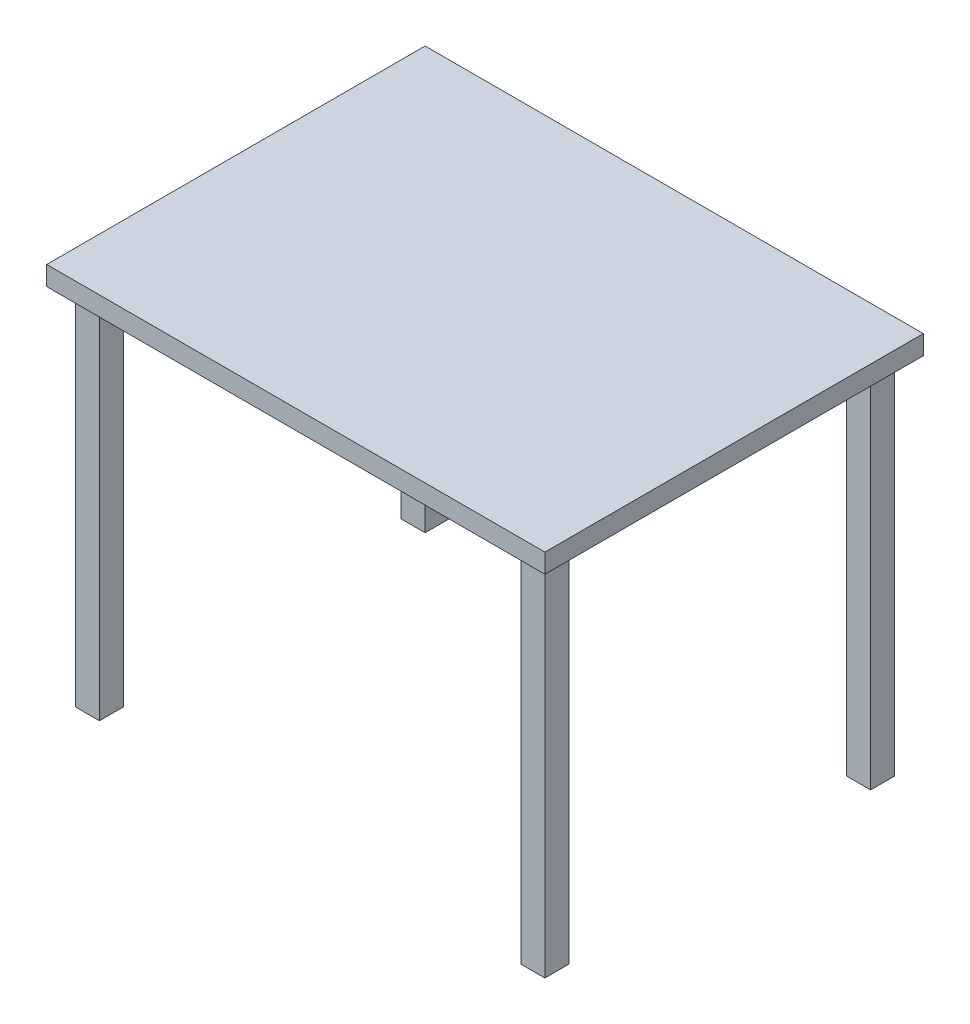
ISO-10303-21;
HEADER;
FILE_DESCRIPTION(('STEP AP214'),'2;1');
FILE_NAME('part.step','',(''),(''),'','','');
FILE_SCHEMA(('AUTOMOTIVE_DESIGN { 1 0 10303 214 1 1 1 1 }'));
ENDSEC;
DATA;
#1=APPLICATION_CONTEXT('core data for automotive mechanical design processes');
#2=APPLICATION_PROTOCOL_DEFINITION('international standard','automotive_design',2000,#1);
#3=PRODUCT_CONTEXT('',#1,'mechanical');
#4=PRODUCT('Part','Part','',(#3));
#5=PRODUCT_RELATED_PRODUCT_CATEGORY('part','',(#4));
#6=PRODUCT_DEFINITION_FORMATION('','',#4);
#7=PRODUCT_DEFINITION_CONTEXT('part definition',#1,'design');
#8=PRODUCT_DEFINITION('design','',#6,#7);
#9=PRODUCT_DEFINITION_SHAPE('','',#8);
#10=(LENGTH_UNIT() NAMED_UNIT(*) SI_UNIT(.MILLI.,.METRE.));
#11=(NAMED_UNIT(*) PLANE_ANGLE_UNIT() SI_UNIT($,.RADIAN.));
#12=(NAMED_UNIT(*) SI_UNIT($,.STERADIAN.) SOLID_ANGLE_UNIT());
#13=UNCERTAINTY_MEASURE_WITH_UNIT(LENGTH_MEASURE(1.E-05),#10,'distance_accuracy_value','');
#14=(GEOMETRIC_REPRESENTATION_CONTEXT(3) GLOBAL_UNCERTAINTY_ASSIGNED_CONTEXT((#13)) GLOBAL_UNIT_ASSIGNED_CONTEXT((#10,
#11,#12)) REPRESENTATION_CONTEXT('',''));
#15=CARTESIAN_POINT('',(0.,0.,0.));
#16=DIRECTION('',(0.,0.,1.));
#17=DIRECTION('',(1.,0.,0.));
#18=AXIS2_PLACEMENT_3D('',#15,#16,#17);
#19=CARTESIAN_POINT('',(0.,-20.,0.));
#20=DIRECTION('',(0.,-1.,0.));
#21=DIRECTION('',(0.,0.,-1.));
#22=AXIS2_PLACEMENT_3D('',#19,#20,#21);
#23=PLANE('',#22);
#24=DIRECTION('',(0.,0.,-1.));
#25=VECTOR('',#24,1.);
#26=CARTESIAN_POINT('',(520.,-20.,395.));
#27=LINE('',#26,#25);
#28=CARTESIAN_POINT('',(520.,-20.,395.));
#29=VERTEX_POINT('',#28);
#30=CARTESIAN_POINT('',(520.,-20.,-395.));
#31=VERTEX_POINT('',#30);
#32=EDGE_CURVE('E332',#29,#31,#27,.T.);
#33=ORIENTED_EDGE('',*,*,#32,.F.);
#34=DIRECTION('',(1.,0.,0.));
#35=VECTOR('',#34,1.);
#36=CARTESIAN_POINT('',(-520.,-20.,395.));
#37=LINE('',#36,#35);
#38=CARTESIAN_POINT('',(-520.,-20.,395.));
#39=VERTEX_POINT('',#38);
#40=EDGE_CURVE('E338',#39,#29,#37,.T.);
#41=ORIENTED_EDGE('',*,*,#40,.F.);
#42=DIRECTION('',(0.,0.,1.));
#43=VECTOR('',#42,1.);
#44=CARTESIAN_POINT('',(-520.,-20.,395.));
#45=LINE('',#44,#43);
#46=CARTESIAN_POINT('',(-520.,-20.,-395.));
#47=VERTEX_POINT('',#46);
#48=EDGE_CURVE('E354',#47,#39,#45,.T.);
#49=ORIENTED_EDGE('',*,*,#48,.F.);
#50=DIRECTION('',(-1.,0.,0.));
#51=VECTOR('',#50,1.);
#52=CARTESIAN_POINT('',(-520.,-20.,-395.));
#53=LINE('',#52,#51);
#54=EDGE_CURVE('E351',#31,#47,#53,.T.);
#55=ORIENTED_EDGE('',*,*,#54,.F.);
#56=EDGE_LOOP('',(#33,#41,#49,#55));
#57=FACE_BOUND('',#56,.T.);
#58=DIRECTION('',(1.,0.,0.));
#59=VECTOR('',#58,1.);
#60=CARTESIAN_POINT('',(-490.,-20.,315.));
#61=LINE('',#60,#59);
#62=CARTESIAN_POINT('',(-490.,-20.,315.));
#63=VERTEX_POINT('',#62);
#64=CARTESIAN_POINT('',(-440.,-20.,315.));
#65=VERTEX_POINT('',#64);
#66=EDGE_CURVE('E310',#63,#65,#61,.T.);
#67=ORIENTED_EDGE('',*,*,#66,.F.);
#68=DIRECTION('',(0.,0.,-1.));
#69=VECTOR('',#68,1.);
#70=CARTESIAN_POINT('',(-490.,-20.,365.));
#71=LINE('',#70,#69);
#72=CARTESIAN_POINT('',(-490.,-20.,365.));
#73=VERTEX_POINT('',#72);
#74=EDGE_CURVE('E291',#73,#63,#71,.T.);
#75=ORIENTED_EDGE('',*,*,#74,.F.);
#76=DIRECTION('',(-1.,0.,0.));
#77=VECTOR('',#76,1.);
#78=CARTESIAN_POINT('',(-490.,-20.,365.));
#79=LINE('',#78,#77);
#80=CARTESIAN_POINT('',(-440.,-20.,365.));
#81=VERTEX_POINT('',#80);
#82=EDGE_CURVE('E297',#81,#73,#79,.T.);
#83=ORIENTED_EDGE('',*,*,#82,.F.);
#84=DIRECTION('',(0.,0.,1.));
#85=VECTOR('',#84,1.);
#86=CARTESIAN_POINT('',(-440.,-20.,365.));
#87=LINE('',#86,#85);
#88=EDGE_CURVE('E313',#65,#81,#87,.T.);
#89=ORIENTED_EDGE('',*,*,#88,.F.);
#90=EDGE_LOOP('',(#67,#75,#83,#89));
#91=FACE_BOUND('',#90,.T.);
#92=DIRECTION('',(1.,0.,0.));
#93=VECTOR('',#92,1.);
#94=CARTESIAN_POINT('',(-490.,-20.,-365.));
#95=LINE('',#94,#93);
#96=CARTESIAN_POINT('',(-490.,-20.,-365.));
#97=VERTEX_POINT('',#96);
#98=CARTESIAN_POINT('',(-440.,-20.,-365.));
#99=VERTEX_POINT('',#98);
#100=EDGE_CURVE('E269',#97,#99,#95,.T.);
#101=ORIENTED_EDGE('',*,*,#100,.F.);
#102=DIRECTION('',(0.,0.,-1.));
#103=VECTOR('',#102,1.);
#104=CARTESIAN_POINT('',(-490.,-20.,-365.));
#105=LINE('',#104,#103);
#106=CARTESIAN_POINT('',(-490.,-20.,-315.));
#107=VERTEX_POINT('',#106);
#108=EDGE_CURVE('E250',#107,#97,#105,.T.);
#109=ORIENTED_EDGE('',*,*,#108,.F.);
#110=DIRECTION('',(-1.,0.,0.));
#111=VECTOR('',#110,1.);
#112=CARTESIAN_POINT('',(-490.,-20.,-315.));
#113=LINE('',#112,#111);
#114=CARTESIAN_POINT('',(-440.,-20.,-315.));
#115=VERTEX_POINT('',#114);
#116=EDGE_CURVE('E256',#115,#107,#113,.T.);
#117=ORIENTED_EDGE('',*,*,#116,.F.);
#118=DIRECTION('',(0.,0.,1.));
#119=VECTOR('',#118,1.);
#120=CARTESIAN_POINT('',(-440.,-20.,-365.));
#121=LINE('',#120,#119);
#122=EDGE_CURVE('E272',#99,#115,#121,.T.);
#123=ORIENTED_EDGE('',*,*,#122,.F.);
#124=EDGE_LOOP('',(#101,#109,#117,#123));
#125=FACE_BOUND('',#124,.T.);
#126=DIRECTION('',(0.,0.,1.));
#127=VECTOR('',#126,1.);
#128=CARTESIAN_POINT('',(490.,-20.,-365.));
#129=LINE('',#128,#127);
#130=CARTESIAN_POINT('',(490.,-20.,-365.));
#131=VERTEX_POINT('',#130);
#132=CARTESIAN_POINT('',(490.,-20.,-315.));
#133=VERTEX_POINT('',#132);
#134=EDGE_CURVE('E211',#131,#133,#129,.T.);
#135=ORIENTED_EDGE('',*,*,#134,.F.);
#136=DIRECTION('',(1.,0.,0.));
#137=VECTOR('',#136,1.);
#138=CARTESIAN_POINT('',(490.,-20.,-365.));
#139=LINE('',#138,#137);
#140=CARTESIAN_POINT('',(440.,-20.,-365.));
#141=VERTEX_POINT('',#140);
#142=EDGE_CURVE('E206',#141,#131,#139,.T.);
#143=ORIENTED_EDGE('',*,*,#142,.F.);
#144=DIRECTION('',(0.,0.,-1.));
#145=VECTOR('',#144,1.);
#146=CARTESIAN_POINT('',(440.,-20.,-365.));
#147=LINE('',#146,#145);
#148=CARTESIAN_POINT('',(440.,-20.,-315.));
#149=VERTEX_POINT('',#148);
#150=EDGE_CURVE('E221',#149,#141,#147,.T.);
#151=ORIENTED_EDGE('',*,*,#150,.F.);
#152=DIRECTION('',(-1.,0.,0.));
#153=VECTOR('',#152,1.);
#154=CARTESIAN_POINT('',(490.,-20.,-315.));
#155=LINE('',#154,#153);
#156=EDGE_CURVE('E233',#133,#149,#155,.T.);
#157=ORIENTED_EDGE('',*,*,#156,.F.);
#158=EDGE_LOOP('',(#135,#143,#151,#157));
#159=FACE_BOUND('',#158,.T.);
#160=DIRECTION('',(-1.,0.,0.));
#161=VECTOR('',#160,1.);
#162=CARTESIAN_POINT('',(490.,-20.,365.));
#163=LINE('',#162,#161);
#164=CARTESIAN_POINT('',(490.,-20.,365.));
#165=VERTEX_POINT('',#164);
#166=CARTESIAN_POINT('',(440.,-20.,365.));
#167=VERTEX_POINT('',#166);
#168=EDGE_CURVE('E635',#165,#167,#163,.T.);
#169=ORIENTED_EDGE('',*,*,#168,.F.);
#170=DIRECTION('',(0.,0.,1.));
#171=VECTOR('',#170,1.);
#172=CARTESIAN_POINT('',(490.,-20.,365.));
#173=LINE('',#172,#171);
#174=CARTESIAN_POINT('',(490.,-20.,315.));
#175=VERTEX_POINT('',#174);
#176=EDGE_CURVE('E203',#175,#165,#173,.T.);
#177=ORIENTED_EDGE('',*,*,#176,.F.);
#178=DIRECTION('',(1.,0.,0.));
#179=VECTOR('',#178,1.);
#180=CARTESIAN_POINT('',(490.,-20.,315.));
#181=LINE('',#180,#179);
#182=CARTESIAN_POINT('',(440.,-20.,315.));
#183=VERTEX_POINT('',#182);
#184=EDGE_CURVE('E199',#183,#175,#181,.T.);
#185=ORIENTED_EDGE('',*,*,#184,.F.);
#186=DIRECTION('',(0.,0.,-1.));
#187=VECTOR('',#186,1.);
#188=CARTESIAN_POINT('',(440.,-20.,365.));
#189=LINE('',#188,#187);
#190=EDGE_CURVE('E631',#167,#183,#189,.T.);
#191=ORIENTED_EDGE('',*,*,#190,.F.);
#192=EDGE_LOOP('',(#169,#177,#185,#191));
#193=FACE_BOUND('',#192,.T.);
#194=ADVANCED_FACE('F39',(#57,#91,#125,#159,#193),#23,.T.);
#195=CARTESIAN_POINT('',(520.,20.,395.));
#196=DIRECTION('',(-1.,0.,0.));
#197=DIRECTION('',(0.,0.,1.));
#198=AXIS2_PLACEMENT_3D('',#195,#196,#197);
#199=PLANE('',#198);
#200=ORIENTED_EDGE('',*,*,#32,.T.);
#201=DIRECTION('',(0.,-1.,0.));
#202=VECTOR('',#201,1.);
#203=CARTESIAN_POINT('',(520.,20.,-395.));
#204=LINE('',#203,#202);
#205=CARTESIAN_POINT('',(520.,20.,-395.));
#206=VERTEX_POINT('',#205);
#207=EDGE_CURVE('E11',#206,#31,#204,.T.);
#208=ORIENTED_EDGE('',*,*,#207,.F.);
#209=DIRECTION('',(0.,0.,-1.));
#210=VECTOR('',#209,1.);
#211=CARTESIAN_POINT('',(520.,20.,395.));
#212=LINE('',#211,#210);
#213=CARTESIAN_POINT('',(520.,20.,395.));
#214=VERTEX_POINT('',#213);
#215=EDGE_CURVE('E333',#214,#206,#212,.T.);
#216=ORIENTED_EDGE('',*,*,#215,.F.);
#217=DIRECTION('',(0.,-1.,0.));
#218=VECTOR('',#217,1.);
#219=CARTESIAN_POINT('',(520.,20.,395.));
#220=LINE('',#219,#218);
#221=EDGE_CURVE('E347',#214,#29,#220,.T.);
#222=ORIENTED_EDGE('',*,*,#221,.T.);
#223=EDGE_LOOP('',(#200,#208,#216,#222));
#224=FACE_BOUND('',#223,.T.);
#225=ADVANCED_FACE('F41',(#224),#199,.F.);
#226=CARTESIAN_POINT('',(-520.,20.,-395.));
#227=DIRECTION('',(0.,0.,1.));
#228=DIRECTION('',(1.,0.,0.));
#229=AXIS2_PLACEMENT_3D('',#226,#227,#228);
#230=PLANE('',#229);
#231=ORIENTED_EDGE('',*,*,#54,.T.);
#232=DIRECTION('',(0.,-1.,0.));
#233=VECTOR('',#232,1.);
#234=CARTESIAN_POINT('',(-520.,20.,-395.));
#235=LINE('',#234,#233);
#236=CARTESIAN_POINT('',(-520.,20.,-395.));
#237=VERTEX_POINT('',#236);
#238=EDGE_CURVE('E48',#237,#47,#235,.T.);
#239=ORIENTED_EDGE('',*,*,#238,.F.);
#240=DIRECTION('',(-1.,0.,0.));
#241=VECTOR('',#240,1.);
#242=CARTESIAN_POINT('',(-520.,20.,-395.));
#243=LINE('',#242,#241);
#244=EDGE_CURVE('E337',#206,#237,#243,.T.);
#245=ORIENTED_EDGE('',*,*,#244,.F.);
#246=ORIENTED_EDGE('',*,*,#207,.T.);
#247=EDGE_LOOP('',(#231,#239,#245,#246));
#248=FACE_BOUND('',#247,.T.);
#249=ADVANCED_FACE('F387',(#248),#230,.F.);
#250=CARTESIAN_POINT('',(-520.,20.,395.));
#251=DIRECTION('',(1.,0.,0.));
#252=DIRECTION('',(0.,0.,-1.));
#253=AXIS2_PLACEMENT_3D('',#250,#251,#252);
#254=PLANE('',#253);
#255=ORIENTED_EDGE('',*,*,#48,.T.);
#256=DIRECTION('',(0.,-1.,0.));
#257=VECTOR('',#256,1.);
#258=CARTESIAN_POINT('',(-520.,20.,395.));
#259=LINE('',#258,#257);
#260=CARTESIAN_POINT('',(-520.,20.,395.));
#261=VERTEX_POINT('',#260);
#262=EDGE_CURVE('E362',#261,#39,#259,.T.);
#263=ORIENTED_EDGE('',*,*,#262,.F.);
#264=DIRECTION('',(0.,0.,1.));
#265=VECTOR('',#264,1.);
#266=CARTESIAN_POINT('',(-520.,20.,395.));
#267=LINE('',#266,#265);
#268=EDGE_CURVE('E341',#237,#261,#267,.T.);
#269=ORIENTED_EDGE('',*,*,#268,.F.);
#270=ORIENTED_EDGE('',*,*,#238,.T.);
#271=EDGE_LOOP('',(#255,#263,#269,#270));
#272=FACE_BOUND('',#271,.T.);
#273=ADVANCED_FACE('F371',(#272),#254,.F.);
#274=CARTESIAN_POINT('',(-520.,20.,395.));
#275=DIRECTION('',(0.,0.,-1.));
#276=DIRECTION('',(-1.,0.,0.));
#277=AXIS2_PLACEMENT_3D('',#274,#275,#276);
#278=PLANE('',#277);
#279=ORIENTED_EDGE('',*,*,#40,.T.);
#280=ORIENTED_EDGE('',*,*,#221,.F.);
#281=DIRECTION('',(1.,0.,0.));
#282=VECTOR('',#281,1.);
#283=CARTESIAN_POINT('',(-520.,20.,395.));
#284=LINE('',#283,#282);
#285=EDGE_CURVE('E344',#261,#214,#284,.T.);
#286=ORIENTED_EDGE('',*,*,#285,.F.);
#287=ORIENTED_EDGE('',*,*,#262,.T.);
#288=EDGE_LOOP('',(#279,#280,#286,#287));
#289=FACE_BOUND('',#288,.T.);
#290=ADVANCED_FACE('F380',(#289),#278,.F.);
#291=CARTESIAN_POINT('',(0.,20.,0.));
#292=DIRECTION('',(0.,-1.,0.));
#293=DIRECTION('',(0.,0.,-1.));
#294=AXIS2_PLACEMENT_3D('',#291,#292,#293);
#295=PLANE('',#294);
#296=ORIENTED_EDGE('',*,*,#215,.T.);
#297=ORIENTED_EDGE('',*,*,#244,.T.);
#298=ORIENTED_EDGE('',*,*,#268,.T.);
#299=ORIENTED_EDGE('',*,*,#285,.T.);
#300=EDGE_LOOP('',(#296,#297,#298,#299));
#301=FACE_BOUND('',#300,.T.);
#302=ADVANCED_FACE('F386',(#301),#295,.F.);
#303=CARTESIAN_POINT('',(-490.,-780.,365.));
#304=DIRECTION('',(1.,0.,0.));
#305=DIRECTION('',(0.,0.,-1.));
#306=AXIS2_PLACEMENT_3D('',#303,#304,#305);
#307=PLANE('',#306);
#308=ORIENTED_EDGE('',*,*,#74,.T.);
#309=DIRECTION('',(0.,1.,0.));
#310=VECTOR('',#309,1.);
#311=CARTESIAN_POINT('',(-490.,-780.,315.));
#312=LINE('',#311,#310);
#313=CARTESIAN_POINT('',(-490.,-780.,315.));
#314=VERTEX_POINT('',#313);
#315=EDGE_CURVE('E329',#314,#63,#312,.T.);
#316=ORIENTED_EDGE('',*,*,#315,.F.);
#317=DIRECTION('',(0.,0.,-1.));
#318=VECTOR('',#317,1.);
#319=CARTESIAN_POINT('',(-490.,-780.,365.));
#320=LINE('',#319,#318);
#321=CARTESIAN_POINT('',(-490.,-780.,365.));
#322=VERTEX_POINT('',#321);
#323=EDGE_CURVE('E292',#322,#314,#320,.T.);
#324=ORIENTED_EDGE('',*,*,#323,.F.);
#325=DIRECTION('',(0.,1.,0.));
#326=VECTOR('',#325,1.);
#327=CARTESIAN_POINT('',(-490.,-780.,365.));
#328=LINE('',#327,#326);
#329=EDGE_CURVE('E306',#322,#73,#328,.T.);
#330=ORIENTED_EDGE('',*,*,#329,.T.);
#331=EDGE_LOOP('',(#308,#316,#324,#330));
#332=FACE_BOUND('',#331,.T.);
#333=ADVANCED_FACE('F405',(#332),#307,.F.);
#334=CARTESIAN_POINT('',(-490.,-780.,315.));
#335=DIRECTION('',(0.,0.,1.));
#336=DIRECTION('',(1.,0.,0.));
#337=AXIS2_PLACEMENT_3D('',#334,#335,#336);
#338=PLANE('',#337);
#339=ORIENTED_EDGE('',*,*,#66,.T.);
#340=DIRECTION('',(0.,1.,0.));
#341=VECTOR('',#340,1.);
#342=CARTESIAN_POINT('',(-440.,-780.,315.));
#343=LINE('',#342,#341);
#344=CARTESIAN_POINT('',(-440.,-780.,315.));
#345=VERTEX_POINT('',#344);
#346=EDGE_CURVE('E325',#345,#65,#343,.T.);
#347=ORIENTED_EDGE('',*,*,#346,.F.);
#348=DIRECTION('',(1.,0.,0.));
#349=VECTOR('',#348,1.);
#350=CARTESIAN_POINT('',(-490.,-780.,315.));
#351=LINE('',#350,#349);
#352=EDGE_CURVE('E296',#314,#345,#351,.T.);
#353=ORIENTED_EDGE('',*,*,#352,.F.);
#354=ORIENTED_EDGE('',*,*,#315,.T.);
#355=EDGE_LOOP('',(#339,#347,#353,#354));
#356=FACE_BOUND('',#355,.T.);
#357=ADVANCED_FACE('F409',(#356),#338,.F.);
#358=CARTESIAN_POINT('',(-440.,-780.,365.));
#359=DIRECTION('',(-1.,0.,0.));
#360=DIRECTION('',(0.,0.,1.));
#361=AXIS2_PLACEMENT_3D('',#358,#359,#360);
#362=PLANE('',#361);
#363=ORIENTED_EDGE('',*,*,#88,.T.);
#364=DIRECTION('',(0.,1.,0.));
#365=VECTOR('',#364,1.);
#366=CARTESIAN_POINT('',(-440.,-780.,365.));
#367=LINE('',#366,#365);
#368=CARTESIAN_POINT('',(-440.,-780.,365.));
#369=VERTEX_POINT('',#368);
#370=EDGE_CURVE('E322',#369,#81,#367,.T.);
#371=ORIENTED_EDGE('',*,*,#370,.F.);
#372=DIRECTION('',(0.,0.,1.));
#373=VECTOR('',#372,1.);
#374=CARTESIAN_POINT('',(-440.,-780.,365.));
#375=LINE('',#374,#373);
#376=EDGE_CURVE('E300',#345,#369,#375,.T.);
#377=ORIENTED_EDGE('',*,*,#376,.F.);
#378=ORIENTED_EDGE('',*,*,#346,.T.);
#379=EDGE_LOOP('',(#363,#371,#377,#378));
#380=FACE_BOUND('',#379,.T.);
#381=ADVANCED_FACE('F414',(#380),#362,.F.);
#382=CARTESIAN_POINT('',(-490.,-780.,365.));
#383=DIRECTION('',(0.,0.,-1.));
#384=DIRECTION('',(-1.,0.,0.));
#385=AXIS2_PLACEMENT_3D('',#382,#383,#384);
#386=PLANE('',#385);
#387=ORIENTED_EDGE('',*,*,#82,.T.);
#388=ORIENTED_EDGE('',*,*,#329,.F.);
#389=DIRECTION('',(-1.,0.,0.));
#390=VECTOR('',#389,1.);
#391=CARTESIAN_POINT('',(-490.,-780.,365.));
#392=LINE('',#391,#390);
#393=EDGE_CURVE('E303',#369,#322,#392,.T.);
#394=ORIENTED_EDGE('',*,*,#393,.F.);
#395=ORIENTED_EDGE('',*,*,#370,.T.);
#396=EDGE_LOOP('',(#387,#388,#394,#395));
#397=FACE_BOUND('',#396,.T.);
#398=ADVANCED_FACE('F420',(#397),#386,.F.);
#399=CARTESIAN_POINT('',(0.,-780.,0.));
#400=DIRECTION('',(0.,-1.,0.));
#401=DIRECTION('',(0.,0.,-1.));
#402=AXIS2_PLACEMENT_3D('',#399,#400,#401);
#403=PLANE('',#402);
#404=ORIENTED_EDGE('',*,*,#323,.T.);
#405=ORIENTED_EDGE('',*,*,#352,.T.);
#406=ORIENTED_EDGE('',*,*,#376,.T.);
#407=ORIENTED_EDGE('',*,*,#393,.T.);
#408=EDGE_LOOP('',(#404,#405,#406,#407));
#409=FACE_BOUND('',#408,.T.);
#410=ADVANCED_FACE('F424',(#409),#403,.T.);
#411=CARTESIAN_POINT('',(-490.,-780.,-365.));
#412=DIRECTION('',(1.,0.,0.));
#413=DIRECTION('',(0.,0.,-1.));
#414=AXIS2_PLACEMENT_3D('',#411,#412,#413);
#415=PLANE('',#414);
#416=ORIENTED_EDGE('',*,*,#108,.T.);
#417=DIRECTION('',(0.,1.,0.));
#418=VECTOR('',#417,1.);
#419=CARTESIAN_POINT('',(-490.,-780.,-365.));
#420=LINE('',#419,#418);
#421=CARTESIAN_POINT('',(-490.,-780.,-365.));
#422=VERTEX_POINT('',#421);
#423=EDGE_CURVE('E288',#422,#97,#420,.T.);
#424=ORIENTED_EDGE('',*,*,#423,.F.);
#425=DIRECTION('',(0.,0.,-1.));
#426=VECTOR('',#425,1.);
#427=CARTESIAN_POINT('',(-490.,-780.,-365.));
#428=LINE('',#427,#426);
#429=CARTESIAN_POINT('',(-490.,-780.,-315.));
#430=VERTEX_POINT('',#429);
#431=EDGE_CURVE('E251',#430,#422,#428,.T.);
#432=ORIENTED_EDGE('',*,*,#431,.F.);
#433=DIRECTION('',(0.,1.,0.));
#434=VECTOR('',#433,1.);
#435=CARTESIAN_POINT('',(-490.,-780.,-315.));
#436=LINE('',#435,#434);
#437=EDGE_CURVE('E265',#430,#107,#436,.T.);
#438=ORIENTED_EDGE('',*,*,#437,.T.);
#439=EDGE_LOOP('',(#416,#424,#432,#438));
#440=FACE_BOUND('',#439,.T.);
#441=ADVANCED_FACE('F428',(#440),#415,.F.);
#442=CARTESIAN_POINT('',(-490.,-780.,-365.));
#443=DIRECTION('',(0.,0.,1.));
#444=DIRECTION('',(1.,0.,0.));
#445=AXIS2_PLACEMENT_3D('',#442,#443,#444);
#446=PLANE('',#445);
#447=ORIENTED_EDGE('',*,*,#100,.T.);
#448=DIRECTION('',(0.,1.,0.));
#449=VECTOR('',#448,1.);
#450=CARTESIAN_POINT('',(-440.,-780.,-365.));
#451=LINE('',#450,#449);
#452=CARTESIAN_POINT('',(-440.,-780.,-365.));
#453=VERTEX_POINT('',#452);
#454=EDGE_CURVE('E284',#453,#99,#451,.T.);
#455=ORIENTED_EDGE('',*,*,#454,.F.);
#456=DIRECTION('',(1.,0.,0.));
#457=VECTOR('',#456,1.);
#458=CARTESIAN_POINT('',(-490.,-780.,-365.));
#459=LINE('',#458,#457);
#460=EDGE_CURVE('E255',#422,#453,#459,.T.);
#461=ORIENTED_EDGE('',*,*,#460,.F.);
#462=ORIENTED_EDGE('',*,*,#423,.T.);
#463=EDGE_LOOP('',(#447,#455,#461,#462));
#464=FACE_BOUND('',#463,.T.);
#465=ADVANCED_FACE('F432',(#464),#446,.F.);
#466=CARTESIAN_POINT('',(-440.,-780.,-365.));
#467=DIRECTION('',(-1.,0.,0.));
#468=DIRECTION('',(0.,0.,1.));
#469=AXIS2_PLACEMENT_3D('',#466,#467,#468);
#470=PLANE('',#469);
#471=ORIENTED_EDGE('',*,*,#122,.T.);
#472=DIRECTION('',(0.,1.,0.));
#473=VECTOR('',#472,1.);
#474=CARTESIAN_POINT('',(-440.,-780.,-315.));
#475=LINE('',#474,#473);
#476=CARTESIAN_POINT('',(-440.,-780.,-315.));
#477=VERTEX_POINT('',#476);
#478=EDGE_CURVE('E281',#477,#115,#475,.T.);
#479=ORIENTED_EDGE('',*,*,#478,.F.);
#480=DIRECTION('',(0.,0.,1.));
#481=VECTOR('',#480,1.);
#482=CARTESIAN_POINT('',(-440.,-780.,-365.));
#483=LINE('',#482,#481);
#484=EDGE_CURVE('E259',#453,#477,#483,.T.);
#485=ORIENTED_EDGE('',*,*,#484,.F.);
#486=ORIENTED_EDGE('',*,*,#454,.T.);
#487=EDGE_LOOP('',(#471,#479,#485,#486));
#488=FACE_BOUND('',#487,.T.);
#489=ADVANCED_FACE('F436',(#488),#470,.F.);
#490=CARTESIAN_POINT('',(-490.,-780.,-315.));
#491=DIRECTION('',(0.,0.,-1.));
#492=DIRECTION('',(-1.,0.,0.));
#493=AXIS2_PLACEMENT_3D('',#490,#491,#492);
#494=PLANE('',#493);
#495=ORIENTED_EDGE('',*,*,#116,.T.);
#496=ORIENTED_EDGE('',*,*,#437,.F.);
#497=DIRECTION('',(-1.,0.,0.));
#498=VECTOR('',#497,1.);
#499=CARTESIAN_POINT('',(-490.,-780.,-315.));
#500=LINE('',#499,#498);
#501=EDGE_CURVE('E262',#477,#430,#500,.T.);
#502=ORIENTED_EDGE('',*,*,#501,.F.);
#503=ORIENTED_EDGE('',*,*,#478,.T.);
#504=EDGE_LOOP('',(#495,#496,#502,#503));
#505=FACE_BOUND('',#504,.T.);
#506=ADVANCED_FACE('F440',(#505),#494,.F.);
#507=CARTESIAN_POINT('',(0.,-780.,0.));
#508=DIRECTION('',(0.,1.,0.));
#509=DIRECTION('',(0.,0.,1.));
#510=AXIS2_PLACEMENT_3D('',#507,#508,#509);
#511=PLANE('',#510);
#512=ORIENTED_EDGE('',*,*,#431,.T.);
#513=ORIENTED_EDGE('',*,*,#460,.T.);
#514=ORIENTED_EDGE('',*,*,#484,.T.);
#515=ORIENTED_EDGE('',*,*,#501,.T.);
#516=EDGE_LOOP('',(#512,#513,#514,#515));
#517=FACE_BOUND('',#516,.T.);
#518=ADVANCED_FACE('F444',(#517),#511,.F.);
#519=CARTESIAN_POINT('',(490.,-780.,-365.));
#520=DIRECTION('',(0.,0.,1.));
#521=DIRECTION('',(1.,0.,0.));
#522=AXIS2_PLACEMENT_3D('',#519,#520,#521);
#523=PLANE('',#522);
#524=ORIENTED_EDGE('',*,*,#142,.T.);
#525=DIRECTION('',(0.,1.,0.));
#526=VECTOR('',#525,1.);
#527=CARTESIAN_POINT('',(490.,-780.,-365.));
#528=LINE('',#527,#526);
#529=CARTESIAN_POINT('',(490.,-780.,-365.));
#530=VERTEX_POINT('',#529);
#531=EDGE_CURVE('E247',#530,#131,#528,.T.);
#532=ORIENTED_EDGE('',*,*,#531,.F.);
#533=DIRECTION('',(1.,0.,0.));
#534=VECTOR('',#533,1.);
#535=CARTESIAN_POINT('',(490.,-780.,-365.));
#536=LINE('',#535,#534);
#537=CARTESIAN_POINT('',(440.,-780.,-365.));
#538=VERTEX_POINT('',#537);
#539=EDGE_CURVE('E216',#538,#530,#536,.T.);
#540=ORIENTED_EDGE('',*,*,#539,.F.);
#541=DIRECTION('',(0.,1.,0.));
#542=VECTOR('',#541,1.);
#543=CARTESIAN_POINT('',(440.,-780.,-365.));
#544=LINE('',#543,#542);
#545=EDGE_CURVE('E229',#538,#141,#544,.T.);
#546=ORIENTED_EDGE('',*,*,#545,.T.);
#547=EDGE_LOOP('',(#524,#532,#540,#546));
#548=FACE_BOUND('',#547,.T.);
#549=ADVANCED_FACE('F448',(#548),#523,.F.);
#550=CARTESIAN_POINT('',(490.,-780.,-365.));
#551=DIRECTION('',(-1.,0.,0.));
#552=DIRECTION('',(0.,0.,1.));
#553=AXIS2_PLACEMENT_3D('',#550,#551,#552);
#554=PLANE('',#553);
#555=ORIENTED_EDGE('',*,*,#134,.T.);
#556=DIRECTION('',(0.,1.,0.));
#557=VECTOR('',#556,1.);
#558=CARTESIAN_POINT('',(490.,-780.,-315.));
#559=LINE('',#558,#557);
#560=CARTESIAN_POINT('',(490.,-780.,-315.));
#561=VERTEX_POINT('',#560);
#562=EDGE_CURVE('E243',#561,#133,#559,.T.);
#563=ORIENTED_EDGE('',*,*,#562,.F.);
#564=DIRECTION('',(0.,0.,1.));
#565=VECTOR('',#564,1.);
#566=CARTESIAN_POINT('',(490.,-780.,-365.));
#567=LINE('',#566,#565);
#568=EDGE_CURVE('E220',#530,#561,#567,.T.);
#569=ORIENTED_EDGE('',*,*,#568,.F.);
#570=ORIENTED_EDGE('',*,*,#531,.T.);
#571=EDGE_LOOP('',(#555,#563,#569,#570));
#572=FACE_BOUND('',#571,.T.);
#573=ADVANCED_FACE('F452',(#572),#554,.F.);
#574=CARTESIAN_POINT('',(490.,-780.,-315.));
#575=DIRECTION('',(0.,0.,-1.));
#576=DIRECTION('',(-1.,0.,0.));
#577=AXIS2_PLACEMENT_3D('',#574,#575,#576);
#578=PLANE('',#577);
#579=ORIENTED_EDGE('',*,*,#156,.T.);
#580=DIRECTION('',(0.,1.,0.));
#581=VECTOR('',#580,1.);
#582=CARTESIAN_POINT('',(440.,-780.,-315.));
#583=LINE('',#582,#581);
#584=CARTESIAN_POINT('',(440.,-780.,-315.));
#585=VERTEX_POINT('',#584);
#586=EDGE_CURVE('E63',#585,#149,#583,.T.);
#587=ORIENTED_EDGE('',*,*,#586,.F.);
#588=DIRECTION('',(-1.,0.,0.));
#589=VECTOR('',#588,1.);
#590=CARTESIAN_POINT('',(490.,-780.,-315.));
#591=LINE('',#590,#589);
#592=EDGE_CURVE('E224',#561,#585,#591,.T.);
#593=ORIENTED_EDGE('',*,*,#592,.F.);
#594=ORIENTED_EDGE('',*,*,#562,.T.);
#595=EDGE_LOOP('',(#579,#587,#593,#594));
#596=FACE_BOUND('',#595,.T.);
#597=ADVANCED_FACE('F456',(#596),#578,.F.);
#598=CARTESIAN_POINT('',(440.,-780.,-365.));
#599=DIRECTION('',(1.,0.,0.));
#600=DIRECTION('',(0.,0.,-1.));
#601=AXIS2_PLACEMENT_3D('',#598,#599,#600);
#602=PLANE('',#601);
#603=ORIENTED_EDGE('',*,*,#150,.T.);
#604=ORIENTED_EDGE('',*,*,#545,.F.);
#605=DIRECTION('',(0.,0.,-1.));
#606=VECTOR('',#605,1.);
#607=CARTESIAN_POINT('',(440.,-780.,-365.));
#608=LINE('',#607,#606);
#609=EDGE_CURVE('E227',#585,#538,#608,.T.);
#610=ORIENTED_EDGE('',*,*,#609,.F.);
#611=ORIENTED_EDGE('',*,*,#586,.T.);
#612=EDGE_LOOP('',(#603,#604,#610,#611));
#613=FACE_BOUND('',#612,.T.);
#614=ADVANCED_FACE('F460',(#613),#602,.F.);
#615=CARTESIAN_POINT('',(0.,-780.,0.));
#616=DIRECTION('',(0.,1.,0.));
#617=DIRECTION('',(0.,0.,1.));
#618=AXIS2_PLACEMENT_3D('',#615,#616,#617);
#619=PLANE('',#618);
#620=ORIENTED_EDGE('',*,*,#539,.T.);
#621=ORIENTED_EDGE('',*,*,#568,.T.);
#622=ORIENTED_EDGE('',*,*,#592,.T.);
#623=ORIENTED_EDGE('',*,*,#609,.T.);
#624=EDGE_LOOP('',(#620,#621,#622,#623));
#625=FACE_BOUND('',#624,.T.);
#626=ADVANCED_FACE('F464',(#625),#619,.F.);
#627=CARTESIAN_POINT('',(490.,-780.,365.));
#628=DIRECTION('',(-1.,0.,0.));
#629=DIRECTION('',(0.,0.,1.));
#630=AXIS2_PLACEMENT_3D('',#627,#628,#629);
#631=PLANE('',#630);
#632=ORIENTED_EDGE('',*,*,#176,.T.);
#633=DIRECTION('',(0.,1.,0.));
#634=VECTOR('',#633,1.);
#635=CARTESIAN_POINT('',(490.,-780.,365.));
#636=LINE('',#635,#634);
#637=CARTESIAN_POINT('',(490.,-780.,365.));
#638=VERTEX_POINT('',#637);
#639=EDGE_CURVE('E182',#638,#165,#636,.T.);
#640=ORIENTED_EDGE('',*,*,#639,.F.);
#641=DIRECTION('',(0.,0.,1.));
#642=VECTOR('',#641,1.);
#643=CARTESIAN_POINT('',(490.,-780.,365.));
#644=LINE('',#643,#642);
#645=CARTESIAN_POINT('',(490.,-780.,315.));
#646=VERTEX_POINT('',#645);
#647=EDGE_CURVE('E190',#646,#638,#644,.T.);
#648=ORIENTED_EDGE('',*,*,#647,.F.);
#649=DIRECTION('',(0.,1.,0.));
#650=VECTOR('',#649,1.);
#651=CARTESIAN_POINT('',(490.,-780.,315.));
#652=LINE('',#651,#650);
#653=EDGE_CURVE('E627',#646,#175,#652,.T.);
#654=ORIENTED_EDGE('',*,*,#653,.T.);
#655=EDGE_LOOP('',(#632,#640,#648,#654));
#656=FACE_BOUND('',#655,.T.);
#657=ADVANCED_FACE('F201',(#656),#631,.F.);
#658=CARTESIAN_POINT('',(490.,-780.,365.));
#659=DIRECTION('',(0.,0.,-1.));
#660=DIRECTION('',(-1.,0.,0.));
#661=AXIS2_PLACEMENT_3D('',#658,#659,#660);
#662=PLANE('',#661);
#663=ORIENTED_EDGE('',*,*,#168,.T.);
#664=DIRECTION('',(0.,1.,0.));
#665=VECTOR('',#664,1.);
#666=CARTESIAN_POINT('',(440.,-780.,365.));
#667=LINE('',#666,#665);
#668=CARTESIAN_POINT('',(440.,-780.,365.));
#669=VERTEX_POINT('',#668);
#670=EDGE_CURVE('E185',#669,#167,#667,.T.);
#671=ORIENTED_EDGE('',*,*,#670,.F.);
#672=DIRECTION('',(-1.,0.,0.));
#673=VECTOR('',#672,1.);
#674=CARTESIAN_POINT('',(490.,-780.,365.));
#675=LINE('',#674,#673);
#676=EDGE_CURVE('E178',#638,#669,#675,.T.);
#677=ORIENTED_EDGE('',*,*,#676,.F.);
#678=ORIENTED_EDGE('',*,*,#639,.T.);
#679=EDGE_LOOP('',(#663,#671,#677,#678));
#680=FACE_BOUND('',#679,.T.);
#681=ADVANCED_FACE('F180',(#680),#662,.F.);
#682=CARTESIAN_POINT('',(440.,-780.,365.));
#683=DIRECTION('',(1.,0.,0.));
#684=DIRECTION('',(0.,0.,-1.));
#685=AXIS2_PLACEMENT_3D('',#682,#683,#684);
#686=PLANE('',#685);
#687=ORIENTED_EDGE('',*,*,#190,.T.);
#688=DIRECTION('',(0.,1.,0.));
#689=VECTOR('',#688,1.);
#690=CARTESIAN_POINT('',(440.,-780.,315.));
#691=LINE('',#690,#689);
#692=CARTESIAN_POINT('',(440.,-780.,315.));
#693=VERTEX_POINT('',#692);
#694=EDGE_CURVE('E55',#693,#183,#691,.T.);
#695=ORIENTED_EDGE('',*,*,#694,.F.);
#696=DIRECTION('',(0.,0.,-1.));
#697=VECTOR('',#696,1.);
#698=CARTESIAN_POINT('',(440.,-780.,365.));
#699=LINE('',#698,#697);
#700=EDGE_CURVE('E189',#669,#693,#699,.T.);
#701=ORIENTED_EDGE('',*,*,#700,.F.);
#702=ORIENTED_EDGE('',*,*,#670,.T.);
#703=EDGE_LOOP('',(#687,#695,#701,#702));
#704=FACE_BOUND('',#703,.T.);
#705=ADVANCED_FACE('F472',(#704),#686,.F.);
#706=CARTESIAN_POINT('',(490.,-780.,315.));
#707=DIRECTION('',(0.,0.,1.));
#708=DIRECTION('',(1.,0.,0.));
#709=AXIS2_PLACEMENT_3D('',#706,#707,#708);
#710=PLANE('',#709);
#711=ORIENTED_EDGE('',*,*,#184,.T.);
#712=ORIENTED_EDGE('',*,*,#653,.F.);
#713=DIRECTION('',(1.,0.,0.));
#714=VECTOR('',#713,1.);
#715=CARTESIAN_POINT('',(490.,-780.,315.));
#716=LINE('',#715,#714);
#717=EDGE_CURVE('E194',#693,#646,#716,.T.);
#718=ORIENTED_EDGE('',*,*,#717,.F.);
#719=ORIENTED_EDGE('',*,*,#694,.T.);
#720=EDGE_LOOP('',(#711,#712,#718,#719));
#721=FACE_BOUND('',#720,.T.);
#722=ADVANCED_FACE('F475',(#721),#710,.F.);
#723=CARTESIAN_POINT('',(0.,-780.,0.));
#724=DIRECTION('',(0.,1.,0.));
#725=DIRECTION('',(0.,0.,1.));
#726=AXIS2_PLACEMENT_3D('',#723,#724,#725);
#727=PLANE('',#726);
#728=ORIENTED_EDGE('',*,*,#647,.T.);
#729=ORIENTED_EDGE('',*,*,#676,.T.);
#730=ORIENTED_EDGE('',*,*,#700,.T.);
#731=ORIENTED_EDGE('',*,*,#717,.T.);
#732=EDGE_LOOP('',(#728,#729,#730,#731));
#733=FACE_BOUND('',#732,.T.);
#734=ADVANCED_FACE('F193',(#733),#727,.F.);
#735=CLOSED_SHELL('',(#194,#225,#249,#273,#290,#302,#333,#357,#381,#398,#410,#441,#465,#489,
#506,#518,#549,#573,#597,#614,#626,#657,#681,#705,#722,#734));
#736=MANIFOLD_SOLID_BREP('B2',#735);
#737=ADVANCED_BREP_SHAPE_REPRESENTATION('',(#18,#736),#14);
#738=SHAPE_DEFINITION_REPRESENTATION(#9,#737);
ENDSEC;
END-ISO-10303-21;
